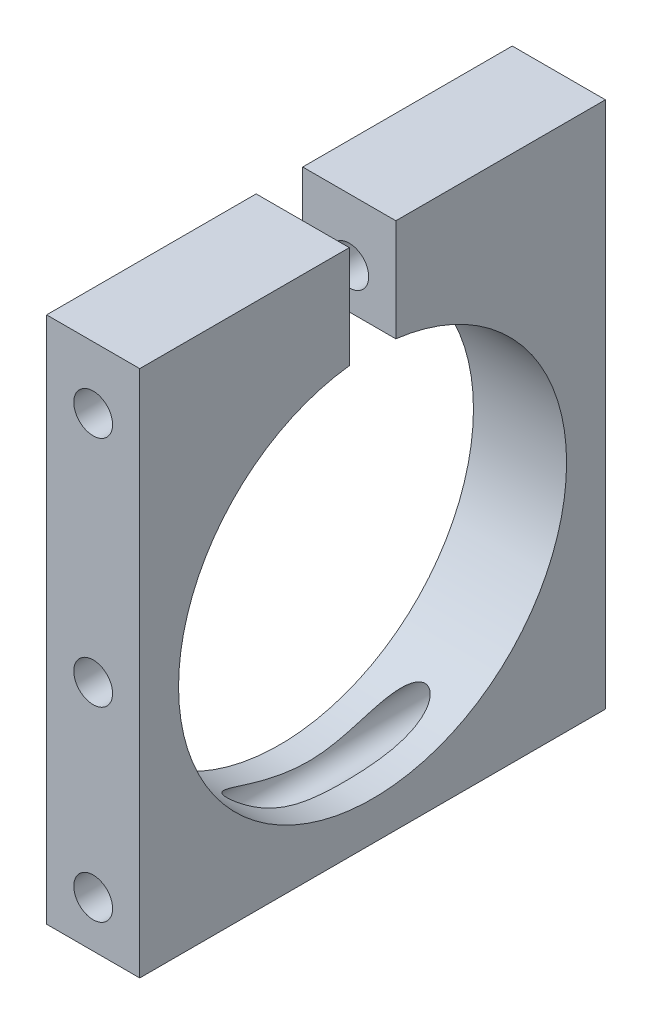
ISO-10303-21;
HEADER;
FILE_DESCRIPTION(('STEP AP214'),'2;1');
FILE_NAME('part.step','',(''),(''),'','','');
FILE_SCHEMA(('AUTOMOTIVE_DESIGN { 1 0 10303 214 1 1 1 1 }'));
ENDSEC;
DATA;
#1=APPLICATION_CONTEXT('core data for automotive mechanical design processes');
#2=APPLICATION_PROTOCOL_DEFINITION('international standard','automotive_design',2000,#1);
#3=PRODUCT_CONTEXT('',#1,'mechanical');
#4=PRODUCT('Part','Part','',(#3));
#5=PRODUCT_RELATED_PRODUCT_CATEGORY('part','',(#4));
#6=PRODUCT_DEFINITION_FORMATION('','',#4);
#7=PRODUCT_DEFINITION_CONTEXT('part definition',#1,'design');
#8=PRODUCT_DEFINITION('design','',#6,#7);
#9=PRODUCT_DEFINITION_SHAPE('','',#8);
#10=(LENGTH_UNIT() NAMED_UNIT(*) SI_UNIT(.MILLI.,.METRE.));
#11=(NAMED_UNIT(*) PLANE_ANGLE_UNIT() SI_UNIT($,.RADIAN.));
#12=(NAMED_UNIT(*) SI_UNIT($,.STERADIAN.) SOLID_ANGLE_UNIT());
#13=UNCERTAINTY_MEASURE_WITH_UNIT(LENGTH_MEASURE(1.E-05),#10,'distance_accuracy_value','');
#14=(GEOMETRIC_REPRESENTATION_CONTEXT(3) GLOBAL_UNCERTAINTY_ASSIGNED_CONTEXT((#13)) GLOBAL_UNIT_ASSIGNED_CONTEXT((#10,
#11,#12)) REPRESENTATION_CONTEXT('',''));
#15=CARTESIAN_POINT('',(0.,0.,0.));
#16=DIRECTION('',(0.,0.,1.));
#17=DIRECTION('',(1.,0.,0.));
#18=AXIS2_PLACEMENT_3D('',#15,#16,#17);
#19=CARTESIAN_POINT('',(81.9999999999995,682.332012286218,-386.357743681072));
#20=DIRECTION('',(0.,0.,-1.));
#21=DIRECTION('',(-1.,0.,0.));
#22=AXIS2_PLACEMENT_3D('',#19,#20,#21);
#23=CYLINDRICAL_SURFACE('',#22,1.25);
#24=CARTESIAN_POINT('',(81.9999999999995,682.332012286218,-387.857743681072));
#25=DIRECTION('',(0.,0.,-1.));
#26=DIRECTION('',(-1.,0.,0.));
#27=AXIS2_PLACEMENT_3D('',#24,#25,#26);
#28=CIRCLE('',#27,1.25);
#29=CARTESIAN_POINT('',(80.7499999999995,682.332012286218,-387.857743681072));
#30=VERTEX_POINT('',#29);
#31=EDGE_CURVE('E153',#30,#30,#28,.T.);
#32=ORIENTED_EDGE('',*,*,#31,.F.);
#33=EDGE_LOOP('',(#32));
#34=FACE_BOUND('',#33,.T.);
#35=CARTESIAN_POINT('',(81.9999999999995,682.332012286218,-401.357743681072));
#36=DIRECTION('',(0.,0.,-1.));
#37=DIRECTION('',(-1.,0.,0.));
#38=AXIS2_PLACEMENT_3D('',#35,#36,#37);
#39=CIRCLE('',#38,1.25);
#40=CARTESIAN_POINT('',(80.7499999999995,682.332012286218,-401.357743681072));
#41=VERTEX_POINT('',#40);
#42=EDGE_CURVE('E157',#41,#41,#39,.T.);
#43=ORIENTED_EDGE('',*,*,#42,.T.);
#44=EDGE_LOOP('',(#43));
#45=FACE_BOUND('',#44,.T.);
#46=ADVANCED_FACE('F17',(#34,#45),#23,.F.);
#47=CARTESIAN_POINT('',(81.9999999999995,667.332012286217,-376.357743681072));
#48=DIRECTION('',(0.,0.,-1.));
#49=DIRECTION('',(0.,1.,0.));
#50=AXIS2_PLACEMENT_3D('',#47,#48,#49);
#51=CYLINDRICAL_SURFACE('',#50,1.25);
#52=CARTESIAN_POINT('',(83.2499999999995,667.332012286217,-373.857743681072));
#53=CARTESIAN_POINT('',(83.2499969955918,667.261985674511,-373.857744480073));
#54=CARTESIAN_POINT('',(83.2440958077508,667.191913630953,-373.858338370804));
#55=CARTESIAN_POINT('',(83.2206441948354,667.053713120907,-373.860650370675));
#56=CARTESIAN_POINT('',(83.2030811574912,666.985586842051,-373.862369696943));
#57=CARTESIAN_POINT('',(83.1568222460876,666.853297784837,-373.866738494325));
#58=CARTESIAN_POINT('',(83.1281330110469,666.789132669263,-373.869387410662));
#59=CARTESIAN_POINT('',(83.060449015238,666.666542320464,-373.875319201094));
#60=CARTESIAN_POINT('',(83.021456264004,666.608115971028,-373.878601951537));
#61=CARTESIAN_POINT('',(82.9341216261066,666.498437842798,-373.885446876922));
#62=CARTESIAN_POINT('',(82.8857502466206,666.447209600073,-373.889009911695));
#63=CARTESIAN_POINT('',(82.7810943273916,666.353584131562,-373.896006720044));
#64=CARTESIAN_POINT('',(82.7248094224967,666.311187313507,-373.899440487646));
#65=CARTESIAN_POINT('',(82.6057767952533,666.23634479774,-373.905798788802));
#66=CARTESIAN_POINT('',(82.5430156101689,666.203920410602,-373.908722226122));
#67=CARTESIAN_POINT('',(82.4129054266863,666.150079276401,-373.913718214551));
#68=CARTESIAN_POINT('',(82.3455565478612,666.128662242568,-373.915790787825));
#69=CARTESIAN_POINT('',(82.2084228017919,666.097513496094,-373.918842628985));
#70=CARTESIAN_POINT('',(82.1386468868123,666.08774273459,-373.919825549594));
#71=CARTESIAN_POINT('',(81.9984390293851,666.080043177061,-373.920598143115));
#72=CARTESIAN_POINT('',(81.9280071032143,666.082114088,-373.920387845554));
#73=CARTESIAN_POINT('',(81.7887561658135,666.098006899871,-373.918801098304));
#74=CARTESIAN_POINT('',(81.7199322266656,666.111786105553,-373.917428885696));
#75=CARTESIAN_POINT('',(81.5855781194365,666.150638141965,-373.913679523273));
#76=CARTESIAN_POINT('',(81.5200480245707,666.175711223612,-373.911302351131));
#77=CARTESIAN_POINT('',(81.3940054119532,666.236487405701,-373.905805949153));
#78=CARTESIAN_POINT('',(81.3335022650871,666.2722098135,-373.902685373601));
#79=CARTESIAN_POINT('',(81.2193390300373,666.353253579349,-373.896055244123));
#80=CARTESIAN_POINT('',(81.1656785779334,666.398574426578,-373.892545710901));
#81=CARTESIAN_POINT('',(81.0664797574863,666.497757882333,-373.885514677716));
#82=CARTESIAN_POINT('',(81.0209766010341,666.551655712007,-373.881993189712));
#83=CARTESIAN_POINT('',(80.9396370083352,666.666373303914,-373.875347269173));
#84=CARTESIAN_POINT('',(80.9038050527791,666.72719625608,-373.872223021033));
#85=CARTESIAN_POINT('',(80.8428305879488,666.854077617356,-373.866722328111));
#86=CARTESIAN_POINT('',(80.8176987553329,666.920141177991,-373.864346630849));
#87=CARTESIAN_POINT('',(80.7789466387922,667.055489106096,-373.860620260684));
#88=CARTESIAN_POINT('',(80.7653019330635,667.124766308539,-373.859267413812));
#89=CARTESIAN_POINT('',(80.7550507429326,667.217423212892,-373.858247851176));
#90=CARTESIAN_POINT('',(80.7531581063268,667.240296935282,-373.858059162288));
#91=CARTESIAN_POINT('',(80.750632239924,667.286114539903,-373.857806950016));
#92=CARTESIAN_POINT('',(80.7499990111671,667.30905842219,-373.857743426736));
#93=CARTESIAN_POINT('',(80.7500030139628,667.401975711905,-373.85774445629));
#94=CARTESIAN_POINT('',(80.7558981102406,667.472031871111,-373.858337745769));
#95=CARTESIAN_POINT('',(80.77933787917,667.610249115089,-373.860648628231));
#96=CARTESIAN_POINT('',(80.7969070446603,667.678405900947,-373.862368584916));
#97=CARTESIAN_POINT('',(80.843180932849,667.810733970928,-373.866738792365));
#98=CARTESIAN_POINT('',(80.8718748618873,667.874909048454,-373.869388141163));
#99=CARTESIAN_POINT('',(80.9395617505016,667.997498864672,-373.875320104249));
#100=CARTESIAN_POINT('',(80.9785498714353,668.055916291999,-373.878602420823));
#101=CARTESIAN_POINT('',(81.0658723326486,668.165579157385,-373.885446415056));
#102=CARTESIAN_POINT('',(81.1142361802256,668.216801048017,-373.889008953019));
#103=CARTESIAN_POINT('',(81.21889097028,668.310429069645,-373.896005788212));
#104=CARTESIAN_POINT('',(81.2751844083647,668.352832414816,-373.899440044637));
#105=CARTESIAN_POINT('',(81.3942539738693,668.42770008865,-373.905800546142));
#106=CARTESIAN_POINT('',(81.4570461783689,668.460138940866,-373.908725480903));
#107=CARTESIAN_POINT('',(81.5871757085338,668.513969659556,-373.913720447834));
#108=CARTESIAN_POINT('',(81.6545078647821,668.53537385823,-373.915791433848));
#109=CARTESIAN_POINT('',(81.7685071332165,668.561272962073,-373.918329737314));
#110=CARTESIAN_POINT('',(81.8144508698856,668.56903945356,-373.919102625982));
#111=CARTESIAN_POINT('',(81.9069230472283,668.579410103843,-373.920138385462));
#112=CARTESIAN_POINT('',(81.9534514855269,668.582014283602,-373.920401258346));
#113=CARTESIAN_POINT('',(82.070025574823,668.582009281437,-373.920399903221));
#114=CARTESIAN_POINT('',(82.1400965838235,668.576108264745,-373.919802959789));
#115=CARTESIAN_POINT('',(82.2782950520943,668.552657360141,-373.917480054416));
#116=CARTESIAN_POINT('',(82.3464203200711,668.535094839859,-373.915752868164));
#117=CARTESIAN_POINT('',(82.4787082967664,668.488837097172,-373.911366985561));
#118=CARTESIAN_POINT('',(82.5428732883818,668.460148359266,-373.908708831876));
#119=CARTESIAN_POINT('',(82.6654614899794,668.392466413102,-373.902761325386));
#120=CARTESIAN_POINT('',(82.7238860079125,668.353475559656,-373.899472116871));
#121=CARTESIAN_POINT('',(82.8335580075294,668.266148201436,-373.892619974992));
#122=CARTESIAN_POINT('',(82.8847823924164,668.217782754015,-373.889056215069));
#123=CARTESIAN_POINT('',(82.9784126815764,668.11312637239,-373.882063127796));
#124=CARTESIAN_POINT('',(83.0208162358817,668.056833332867,-373.878633836465));
#125=CARTESIAN_POINT('',(83.0956842718507,667.937764665402,-373.872287149156));
#126=CARTESIAN_POINT('',(83.1281233183662,667.874972985928,-373.869371071153));
#127=CARTESIAN_POINT('',(83.1819547626129,667.74484407311,-373.864393757066));
#128=CARTESIAN_POINT('',(83.2033594023271,667.677511971308,-373.86233157414));
#129=CARTESIAN_POINT('',(83.2292595334468,667.563511506854,-373.859804653898));
#130=CARTESIAN_POINT('',(83.2370264626378,667.517566451117,-373.859035447254));
#131=CARTESIAN_POINT('',(83.2473976799514,667.425091715335,-373.858004696706));
#132=CARTESIAN_POINT('',(83.2500019971608,667.378562038586,-373.857743149941));
#133=CARTESIAN_POINT('',(83.2499999999995,667.332012286217,-373.857743681072));
#134=B_SPLINE_CURVE_WITH_KNOTS('',3,(#52,#53,#54,#55,#56,#57,#58,#59,#60,#61,#62,#63,#64,#65,
#66,#67,#68,#69,#70,#71,#72,#73,#74,#75,#76,#77,#78,#79,#80,#81,#82,#83,#84,#85,#86,#87,#88,#89,
#90,#91,#92,#93,#94,#95,#96,#97,#98,#99,#100,#101,#102,#103,#104,#105,#106,#107,#108,#109,#110,
#111,#112,#113,#114,#115,#116,#117,#118,#119,#120,#121,#122,#123,#124,#125,#126,#127,#128,#129,
#130,#131,#132,#133),.UNSPECIFIED.,.T.,.F.,(4,2,2,2,2,2,2,2,2,2,2,2,2,2,2,2,2,2,2,2,2,2,2,2,2,2,
2,2,2,2,2,2,2,2,2,2,2,2,2,2,4),(0.,0.209909957865161,0.420047303545414,0.630059452406449,
0.84003067198432,1.05067321971514,1.26132549026481,1.47242483538548,1.6835186805389,
1.89390273872008,2.10428159070432,2.31389655524151,2.52351617703734,2.73351817724369,
2.94350900409216,3.15438552915413,3.36535958675799,3.57654366519953,3.78727762108979,
3.85611047774897,3.92494339125334,4.13474625595609,4.34499069435888,4.55503165420716,
4.76497406242565,4.97558825481878,5.18626888059749,5.39748375910335,5.60846207177879,
5.74799525534997,5.8875278723159,6.09743471510885,6.30756931209431,6.51758162356336,
6.72754597280562,6.93816918873561,7.14884844538226,7.36006109140407,7.57103890318506,
7.71057602162499,7.85011235389017),.UNSPECIFIED.);
#135=CARTESIAN_POINT('',(83.2499999999995,667.332012286217,-373.857743681072));
#136=VERTEX_POINT('',#135);
#137=EDGE_CURVE('E102',#136,#136,#134,.T.);
#138=ORIENTED_EDGE('',*,*,#137,.T.);
#139=EDGE_LOOP('',(#138));
#140=FACE_BOUND('',#139,.T.);
#141=CARTESIAN_POINT('',(81.9999999999995,667.332012286217,-371.357743681072));
#142=DIRECTION('',(0.,0.,-1.));
#143=DIRECTION('',(0.,1.,0.));
#144=AXIS2_PLACEMENT_3D('',#141,#142,#143);
#145=CIRCLE('',#144,1.25);
#146=CARTESIAN_POINT('',(81.9999999999995,668.582012286217,-371.357743681072));
#147=VERTEX_POINT('',#146);
#148=EDGE_CURVE('E139',#147,#147,#145,.F.);
#149=ORIENTED_EDGE('',*,*,#148,.T.);
#150=EDGE_LOOP('',(#149));
#151=FACE_BOUND('',#150,.T.);
#152=ADVANCED_FACE('F278',(#140,#151),#51,.F.);
#153=CARTESIAN_POINT('',(81.9999999999995,682.332012286218,-386.357743681072));
#154=DIRECTION('',(0.,0.,-1.));
#155=DIRECTION('',(-1.,0.,0.));
#156=AXIS2_PLACEMENT_3D('',#153,#154,#155);
#157=CYLINDRICAL_SURFACE('',#156,1.25);
#158=CARTESIAN_POINT('',(81.9999999999995,682.332012286218,-384.857743681072));
#159=DIRECTION('',(0.,0.,-1.));
#160=DIRECTION('',(-1.,0.,0.));
#161=AXIS2_PLACEMENT_3D('',#158,#159,#160);
#162=CIRCLE('',#161,1.25);
#163=CARTESIAN_POINT('',(80.7499999999995,682.332012286218,-384.857743681072));
#164=VERTEX_POINT('',#163);
#165=EDGE_CURVE('E20',#164,#164,#162,.F.);
#166=ORIENTED_EDGE('',*,*,#165,.F.);
#167=EDGE_LOOP('',(#166));
#168=FACE_BOUND('',#167,.T.);
#169=CARTESIAN_POINT('',(81.9999999999995,682.332012286218,-371.357743681072));
#170=DIRECTION('',(0.,0.,-1.));
#171=DIRECTION('',(-1.,0.,0.));
#172=AXIS2_PLACEMENT_3D('',#169,#170,#171);
#173=CIRCLE('',#172,1.25);
#174=CARTESIAN_POINT('',(80.7499999999995,682.332012286218,-371.357743681072));
#175=VERTEX_POINT('',#174);
#176=EDGE_CURVE('E168',#175,#175,#173,.F.);
#177=ORIENTED_EDGE('',*,*,#176,.T.);
#178=EDGE_LOOP('',(#177));
#179=FACE_BOUND('',#178,.T.);
#180=ADVANCED_FACE('F207',(#168,#179),#157,.F.);
#181=CARTESIAN_POINT('',(81.9999999999991,655.332012286218,-386.357743681072));
#182=DIRECTION('',(0.,0.,-1.));
#183=DIRECTION('',(-1.,0.,0.));
#184=AXIS2_PLACEMENT_3D('',#181,#182,#183);
#185=CYLINDRICAL_SURFACE('',#184,1.25);
#186=CARTESIAN_POINT('',(81.9999999999991,656.582012286218,-392.736419092158));
#187=CARTESIAN_POINT('',(81.9620583239072,656.582010238259,-392.736415954482));
#188=CARTESIAN_POINT('',(81.924092424661,656.580267699896,-392.733481741806));
#189=CARTESIAN_POINT('',(81.8493161520983,656.573466964166,-392.721998875565));
#190=CARTESIAN_POINT('',(81.8125071857353,656.568404881837,-392.713443643527));
#191=CARTESIAN_POINT('',(81.7412030755132,656.55546226832,-392.691473109544));
#192=CARTESIAN_POINT('',(81.706694051138,656.547600895967,-392.678090836825));
#193=CARTESIAN_POINT('',(81.6401977453358,656.529606155248,-392.647285870885));
#194=CARTESIAN_POINT('',(81.6082111558142,656.519472166411,-392.629862074202));
#195=CARTESIAN_POINT('',(81.5265699685594,656.490157835122,-392.579119477516));
#196=CARTESIAN_POINT('',(81.4792623082635,656.469434438726,-392.542921400854));
#197=CARTESIAN_POINT('',(81.3916134568367,656.425078541258,-392.464366687458));
#198=CARTESIAN_POINT('',(81.3512946139946,656.40143710719,-392.421991063913));
#199=CARTESIAN_POINT('',(81.2820265090196,656.35596481696,-392.33923964225));
#200=CARTESIAN_POINT('',(81.2522758180749,656.334340957646,-392.299408491014));
#201=CARTESIAN_POINT('',(81.1967553203672,656.2904221462,-392.217390405549));
#202=CARTESIAN_POINT('',(81.1709885735707,656.268126693785,-392.175201694063));
#203=CARTESIAN_POINT('',(81.0988273355814,656.200772047024,-392.045880474076));
#204=CARTESIAN_POINT('',(81.057632127511,656.155287151921,-391.956069829445));
#205=CARTESIAN_POINT('',(80.9850112472775,656.063972516427,-391.769982309982));
#206=CARTESIAN_POINT('',(80.9538395520347,656.018160043598,-391.673602763513));
#207=CARTESIAN_POINT('',(80.9000621212427,655.92815231727,-391.477666883314));
#208=CARTESIAN_POINT('',(80.8774654730462,655.883958824019,-391.378107299983));
#209=CARTESIAN_POINT('',(80.8390077502221,655.797663635509,-391.176546350131));
#210=CARTESIAN_POINT('',(80.823163424346,655.755567367847,-391.074539567206));
#211=CARTESIAN_POINT('',(80.7968988380114,655.67389588095,-390.868903153366));
#212=CARTESIAN_POINT('',(80.7864763712189,655.634319641995,-390.765274200279));
#213=CARTESIAN_POINT('',(80.768425503736,655.550807029784,-390.537516039533));
#214=CARTESIAN_POINT('',(80.761663950458,655.507408094444,-390.413122917612));
#215=CARTESIAN_POINT('',(80.7527315866522,655.424516557999,-390.162862736094));
#216=CARTESIAN_POINT('',(80.7505619648898,655.385024970956,-390.036995303301));
#217=CARTESIAN_POINT('',(80.7496303175335,655.310005675583,-389.783935760658));
#218=CARTESIAN_POINT('',(80.7508718741081,655.274482175002,-389.656742398105));
#219=CARTESIAN_POINT('',(80.7557654346603,655.207491609528,-389.401332739718));
#220=CARTESIAN_POINT('',(80.7594177180169,655.176025015297,-389.273116327024));
#221=CARTESIAN_POINT('',(80.7726450051771,655.087765046217,-388.887180746347));
#222=CARTESIAN_POINT('',(80.7844910557991,655.037094878206,-388.628119188462));
#223=CARTESIAN_POINT('',(80.8082599654921,654.952279894978,-388.107524553008));
#224=CARTESIAN_POINT('',(80.8201827607839,654.918122799614,-387.845993459966));
#225=CARTESIAN_POINT('',(80.8374525033302,654.872191214915,-387.379873878632));
#226=CARTESIAN_POINT('',(80.8436739554429,654.85711830315,-387.175640818062));
#227=CARTESIAN_POINT('',(80.8521232965704,654.83703530649,-386.766852730234));
#228=CARTESIAN_POINT('',(80.8543563234984,654.832012274276,-386.562298457446));
#229=CARTESIAN_POINT('',(80.854355823106,654.832012298446,-386.148294362564));
#230=CARTESIAN_POINT('',(80.852014142554,654.83727861133,-385.938844516084));
#231=CARTESIAN_POINT('',(80.8431743715516,654.858322493095,-385.52052600228));
#232=CARTESIAN_POINT('',(80.8366754334,654.874102205779,-385.311657462217));
#233=CARTESIAN_POINT('',(80.8209743398157,654.916197352921,-384.894287188887));
#234=CARTESIAN_POINT('',(80.8117619379544,654.942552862345,-384.685789915798));
#235=CARTESIAN_POINT('',(80.7928860816381,655.005728115912,-384.270439728651));
#236=CARTESIAN_POINT('',(80.7832226947959,655.042546295648,-384.063586573509));
#237=CARTESIAN_POINT('',(80.7662055876483,655.126808376981,-383.650786127465));
#238=CARTESIAN_POINT('',(80.7588646577961,655.174308738361,-383.444849807547));
#239=CARTESIAN_POINT('',(80.7499658323201,655.279776564456,-383.035347622215));
#240=CARTESIAN_POINT('',(80.7484115587207,655.337750561112,-382.831783320938));
#241=CARTESIAN_POINT('',(80.7536254330404,655.432143929487,-382.529666772488));
#242=CARTESIAN_POINT('',(80.7565977947674,655.464721800743,-382.429839224293));
#243=CARTESIAN_POINT('',(80.7656835527425,655.532334719544,-382.231169680477));
#244=CARTESIAN_POINT('',(80.77179647648,655.567369396766,-382.132327538877));
#245=CARTESIAN_POINT('',(80.7879094782704,655.639761956372,-381.935954464242));
#246=CARTESIAN_POINT('',(80.7979045847039,655.67711681628,-381.838422018587));
#247=CARTESIAN_POINT('',(80.8227006672051,655.754032668351,-381.644865434439));
#248=CARTESIAN_POINT('',(80.8374998012721,655.793592810141,-381.548840732605));
#249=CARTESIAN_POINT('',(80.8639268693705,655.853835060058,-381.407594903611));
#250=CARTESIAN_POINT('',(80.8732760356789,655.873770850079,-381.361625675436));
#251=CARTESIAN_POINT('',(80.8935513123851,655.914059713967,-381.270224064769));
#252=CARTESIAN_POINT('',(80.9044774218229,655.93441278758,-381.22479168195));
#253=CARTESIAN_POINT('',(80.9399967991429,655.996217644722,-381.08900017262));
#254=CARTESIAN_POINT('',(80.9672578594065,656.038240032619,-380.999556589137));
#255=CARTESIAN_POINT('',(81.0199274824556,656.108655702697,-380.854071291457));
#256=CARTESIAN_POINT('',(81.0428168139872,656.136827151103,-380.797008844043));
#257=CARTESIAN_POINT('',(81.0932178730862,656.193220625881,-380.684891357616));
#258=CARTESIAN_POINT('',(81.1207330074112,656.221442674251,-380.62983783475));
#259=CARTESIAN_POINT('',(81.1810256070357,656.27724160796,-380.522877801885));
#260=CARTESIAN_POINT('',(81.213767603685,656.304821499466,-380.470953118648));
#261=CARTESIAN_POINT('',(81.2856056579191,656.358732867007,-380.371063361451));
#262=CARTESIAN_POINT('',(81.3246885446156,656.385066787695,-380.323090384193));
#263=CARTESIAN_POINT('',(81.3984039945546,656.428306800963,-380.245411655401));
#264=CARTESIAN_POINT('',(81.431242796146,656.445795474662,-380.21434026231));
#265=CARTESIAN_POINT('',(81.5012349049624,656.478847628426,-380.156136231997));
#266=CARTESIAN_POINT('',(81.5383914762803,656.494409633395,-380.129006609947));
#267=CARTESIAN_POINT('',(81.6176302241523,656.522846950722,-380.079785112982));
#268=CARTESIAN_POINT('',(81.6597682585349,656.535686175898,-380.057760582642));
#269=CARTESIAN_POINT('',(81.7480796863071,656.557197403672,-380.021039072499));
#270=CARTESIAN_POINT('',(81.7942388630142,656.565883435228,-380.006317418105));
#271=CARTESIAN_POINT('',(81.867526805367,656.575248478394,-379.990478000767));
#272=CARTESIAN_POINT('',(81.8937689600935,656.577772408833,-379.98621831707));
#273=CARTESIAN_POINT('',(81.9466703111573,656.581155042234,-379.980512329084));
#274=CARTESIAN_POINT('',(81.9733295245162,656.582013677049,-379.979066139927));
#275=CARTESIAN_POINT('',(82.0379431249868,656.582010307533,-379.979071300343));
#276=CARTESIAN_POINT('',(82.0759090442073,656.580267660314,-379.982005689429));
#277=CARTESIAN_POINT('',(82.15068483605,656.573466779997,-379.993488795393));
#278=CARTESIAN_POINT('',(82.1874933418833,656.568404770581,-380.002043906785));
#279=CARTESIAN_POINT('',(82.2587968038081,656.555462305607,-380.024014189993));
#280=CARTESIAN_POINT('',(82.2933056180857,656.547600976312,-380.037396388754));
#281=CARTESIAN_POINT('',(82.3598019172153,656.529606255756,-380.068201318227));
#282=CARTESIAN_POINT('',(82.3917886848011,656.519472221268,-380.085625192871));
#283=CARTESIAN_POINT('',(82.4734306665357,656.490157611026,-380.136368272725));
#284=CARTESIAN_POINT('',(82.5207388568984,656.46943392999,-380.172566850275));
#285=CARTESIAN_POINT('',(82.6083875318309,656.42507795949,-380.251121717075));
#286=CARTESIAN_POINT('',(82.6487058428495,656.40143680693,-380.29349684461));
#287=CARTESIAN_POINT('',(82.71797193583,656.355965838171,-380.376245861508));
#288=CARTESIAN_POINT('',(82.7477212931547,656.33434305683,-380.416075004242));
#289=CARTESIAN_POINT('',(82.8032394732142,656.290426450382,-380.498088865034));
#290=CARTESIAN_POINT('',(82.8290052377775,656.268132125269,-380.540275359321));
#291=CARTESIAN_POINT('',(82.9011686584741,656.200776481952,-380.669598135095));
#292=CARTESIAN_POINT('',(82.9423661228589,656.155289349602,-380.759413054181));
#293=CARTESIAN_POINT('',(83.0149955301182,656.063963996806,-380.945522413983));
#294=CARTESIAN_POINT('',(83.0461719614215,656.018143148506,-381.041920146693));
#295=CARTESIAN_POINT('',(83.0999559960588,655.928119619632,-381.237892890135));
#296=CARTESIAN_POINT('',(83.1225545468208,655.883918692809,-381.337471137941));
#297=CARTESIAN_POINT('',(83.1610070953829,655.797625522857,-381.539032702268));
#298=CARTESIAN_POINT('',(83.17684685799,655.75553789349,-381.641020622148));
#299=CARTESIAN_POINT('',(83.2031047850426,655.67388211859,-381.846620245664));
#300=CARTESIAN_POINT('',(83.213525070007,655.63431299295,-381.950231297832));
#301=CARTESIAN_POINT('',(83.2315680156594,655.550836990123,-382.17788961091));
#302=CARTESIAN_POINT('',(83.2383270761529,655.50746553556,-382.302199793624));
#303=CARTESIAN_POINT('',(83.2472596370174,655.424623749421,-382.552292242471));
#304=CARTESIAN_POINT('',(83.2494319563678,655.38515442508,-382.678074879359));
#305=CARTESIAN_POINT('',(83.2503720111253,655.310177100823,-382.930953895138));
#306=CARTESIAN_POINT('',(83.2491364237405,655.274673002208,-383.05805143575));
#307=CARTESIAN_POINT('',(83.244256492208,655.207715213441,-383.313268281298));
#308=CARTESIAN_POINT('',(83.2406118724239,655.176261987273,-383.441387701497));
#309=CARTESIAN_POINT('',(83.2273956349898,655.087956987044,-383.827362126639));
#310=CARTESIAN_POINT('',(83.2155445757064,655.037240426804,-384.086561571913));
#311=CARTESIAN_POINT('',(83.1917613979586,654.952337746909,-384.607521193494));
#312=CARTESIAN_POINT('',(83.1798293182648,654.918144217869,-384.869280168212));
#313=CARTESIAN_POINT('',(83.1643318600961,654.876943347316,-385.287386094101));
#314=CARTESIAN_POINT('',(83.1593392090146,654.864536074686,-385.443161407014));
#315=CARTESIAN_POINT('',(83.1515127504663,654.845568573052,-385.755131046194));
#316=CARTESIAN_POINT('',(83.1486789765784,654.839008434993,-385.911325378939));
#317=CARTESIAN_POINT('',(83.1455364237539,654.83175096809,-386.223906715575));
#318=CARTESIAN_POINT('',(83.1452281489192,654.831054809724,-386.380293751701));
#319=CARTESIAN_POINT('',(83.1471753378965,654.835529912223,-386.692965774245));
#320=CARTESIAN_POINT('',(83.1494307733947,654.840701108289,-386.849250761773));
#321=CARTESIAN_POINT('',(83.1562136435703,654.856884730869,-387.161202639927));
#322=CARTESIAN_POINT('',(83.1607372522147,654.867887322558,-387.316870127969));
#323=CARTESIAN_POINT('',(83.1714768578483,654.895705495017,-387.627630114725));
#324=CARTESIAN_POINT('',(83.1776929233192,654.912521311014,-387.782722589914));
#325=CARTESIAN_POINT('',(83.1909960871109,654.951933144276,-388.092087801963));
#326=CARTESIAN_POINT('',(83.1980829437997,654.974527559936,-388.246360753888));
#327=CARTESIAN_POINT('',(83.2121177456241,655.02546942505,-388.553945229168));
#328=CARTESIAN_POINT('',(83.2190657056347,655.053816254787,-388.707256854256));
#329=CARTESIAN_POINT('',(83.229862277873,655.107382664222,-388.969429208504));
#330=CARTESIAN_POINT('',(83.2340309847143,655.131208253498,-389.078562324953));
#331=CARTESIAN_POINT('',(83.2412009555881,655.181779508066,-389.296165819671));
#332=CARTESIAN_POINT('',(83.2442023906958,655.20852474472,-389.404636292762));
#333=CARTESIAN_POINT('',(83.2506904577832,655.293213178367,-389.729294759829));
#334=CARTESIAN_POINT('',(83.251646287888,655.355550157454,-389.944441170724));
#335=CARTESIAN_POINT('',(83.2436808982311,655.463826112288,-390.283773312811));
#336=CARTESIAN_POINT('',(83.2386324305021,655.506070926952,-390.40923800798));
#337=CARTESIAN_POINT('',(83.2229749056382,655.594404466566,-390.658443682759));
#338=CARTESIAN_POINT('',(83.2123675532997,655.640492009387,-390.782185178901));
#339=CARTESIAN_POINT('',(83.1839250793555,655.736120546514,-391.027060577141));
#340=CARTESIAN_POINT('',(83.166112664557,655.785650290276,-391.148201423692));
#341=CARTESIAN_POINT('',(83.1210398323842,655.887796609134,-391.387333716643));
#342=CARTESIAN_POINT('',(83.0937895849412,655.94040981109,-391.505328406446));
#343=CARTESIAN_POINT('',(83.0386060628278,656.028759801437,-391.695652926489));
#344=CARTESIAN_POINT('',(83.0143436207799,656.063863121243,-391.769334634444));
#345=CARTESIAN_POINT('',(82.9593741840264,656.13457927034,-391.914179772449));
#346=CARTESIAN_POINT('',(82.9286596006216,656.170192653171,-391.985340120787));
#347=CARTESIAN_POINT('',(82.8590752373696,656.241402906818,-392.124417879131));
#348=CARTESIAN_POINT('',(82.8201477098505,656.276997769582,-392.192307906016));
#349=CARTESIAN_POINT('',(82.7323424851211,656.34656097878,-392.322241559134));
#350=CARTESIAN_POINT('',(82.683491221186,656.380533356048,-392.384300089148));
#351=CARTESIAN_POINT('',(82.5975899549996,656.430492754658,-392.473973059982));
#352=CARTESIAN_POINT('',(82.5647036676901,656.447854815704,-392.504793571012));
#353=CARTESIAN_POINT('',(82.4946396747066,656.480632538721,-392.562471875908));
#354=CARTESIAN_POINT('',(82.4574596167261,656.496047124008,-392.589327479102));
#355=CARTESIAN_POINT('',(82.378205434692,656.524174424356,-392.637985922235));
#356=CARTESIAN_POINT('',(82.3360752974507,656.536850452701,-392.659720470505));
#357=CARTESIAN_POINT('',(82.2478395623667,656.55802655704,-392.695856818427));
#358=CARTESIAN_POINT('',(82.201748246176,656.566540951338,-392.710283766546));
#359=CARTESIAN_POINT('',(82.1291808848251,656.575581849032,-392.725572200946));
#360=CARTESIAN_POINT('',(82.1035796276288,656.577981771722,-392.729622326244));
#361=CARTESIAN_POINT('',(82.0519893946064,656.581197761678,-392.735046964606));
#362=CARTESIAN_POINT('',(82.026000384879,656.582013689628,-392.736421242322));
#363=CARTESIAN_POINT('',(81.9999999999991,656.582012286218,-392.736419092158));
#364=B_SPLINE_CURVE_WITH_KNOTS('',3,(#186,#187,#188,#189,#190,#191,#192,#193,#194,#195,#196,
#197,#198,#199,#200,#201,#202,#203,#204,#205,#206,#207,#208,#209,#210,#211,#212,#213,#214,#215,
#216,#217,#218,#219,#220,#221,#222,#223,#224,#225,#226,#227,#228,#229,#230,#231,#232,#233,#234,
#235,#236,#237,#238,#239,#240,#241,#242,#243,#244,#245,#246,#247,#248,#249,#250,#251,#252,#253,
#254,#255,#256,#257,#258,#259,#260,#261,#262,#263,#264,#265,#266,#267,#268,#269,#270,#271,#272,
#273,#274,#275,#276,#277,#278,#279,#280,#281,#282,#283,#284,#285,#286,#287,#288,#289,#290,#291,
#292,#293,#294,#295,#296,#297,#298,#299,#300,#301,#302,#303,#304,#305,#306,#307,#308,#309,#310,
#311,#312,#313,#314,#315,#316,#317,#318,#319,#320,#321,#322,#323,#324,#325,#326,#327,#328,#329,
#330,#331,#332,#333,#334,#335,#336,#337,#338,#339,#340,#341,#342,#343,#344,#345,#346,#347,#348,
#349,#350,#351,#352,#353,#354,#355,#356,#357,#358,#359,#360,#361,#362,#363),.UNSPECIFIED.,.T.,
.F.,(4,2,2,2,2,2,2,2,2,2,2,2,2,2,2,2,2,2,2,2,2,2,2,2,2,2,2,2,2,2,2,2,2,2,2,2,2,2,2,2,2,2,2,2,2,
2,2,2,2,2,2,2,2,2,2,2,2,2,2,2,2,2,2,2,2,2,2,2,2,2,2,2,2,2,2,2,2,2,2,2,2,2,2,2,2,2,2,2,4),(0.,
0.113721890322072,0.227577110903427,0.340667608492681,0.453789019754761,0.641912274934715,
0.830626422084055,0.993034505980403,1.15556671828844,1.48094764319052,1.81402066107331,
2.14744567179975,2.48169297742575,2.81580416014927,3.2113855618147,3.60706935960477,
4.00316883416898,4.39931422075955,5.19142999368,5.98295579047189,6.59733783395487,
7.21092785445183,7.83919972331005,8.46759974317085,9.09840379712628,9.72911358112134,
10.3632387257243,10.997760719724,11.3128502480874,11.6278923838024,11.9425323919414,
12.2570519003815,12.4099373098442,12.5628226262346,12.8699456203733,13.0726891086877,
13.2755825705653,13.4771535795318,13.6783111360104,13.8234251775957,13.9686496432015,
14.1156928119738,14.2622357159922,14.3421696291199,14.4221068131779,14.5358305661655,
14.6496839235348,14.7627738543592,14.8758958326359,15.0640213961683,15.2527332326051,
15.4151334377527,15.5776577036943,15.903054433384,16.2361888414618,16.5696738482152,
16.9038578068543,17.2379109083142,17.633230548689,18.0286519658368,18.4244590647187,
18.8203114588486,19.6128646814016,20.4050621705399,20.8739969727796,21.3429390686486,
21.8119747653572,22.2810052820383,22.7492472701274,23.2175082074617,23.6856395013129,
24.1537203894598,24.489018395203,24.8242672411839,25.4956485398561,25.892956669795,
26.2901430246817,26.6860872769556,27.0816061920162,27.3368315385919,27.5923587667421,
27.849746420935,28.1064572705254,28.2510537321607,28.3957297889431,28.5422379338885,
28.6882383986839,28.7661620224362,28.844092499479),.UNSPECIFIED.);
#365=CARTESIAN_POINT('',(81.9999999999991,656.582012286218,-392.736419092158));
#366=VERTEX_POINT('',#365);
#367=EDGE_CURVE('E105',#366,#366,#364,.T.);
#368=ORIENTED_EDGE('',*,*,#367,.T.);
#369=EDGE_LOOP('',(#368));
#370=FACE_BOUND('',#369,.T.);
#371=CARTESIAN_POINT('',(81.9999999999991,655.332012286218,-401.357743681072));
#372=DIRECTION('',(0.,0.,-1.));
#373=DIRECTION('',(-1.,0.,0.));
#374=AXIS2_PLACEMENT_3D('',#371,#372,#373);
#375=CIRCLE('',#374,1.25);
#376=CARTESIAN_POINT('',(80.7499999999991,655.332012286218,-401.357743681072));
#377=VERTEX_POINT('',#376);
#378=EDGE_CURVE('E135',#377,#377,#375,.T.);
#379=ORIENTED_EDGE('',*,*,#378,.T.);
#380=EDGE_LOOP('',(#379));
#381=FACE_BOUND('',#380,.T.);
#382=CARTESIAN_POINT('',(81.9999999999991,655.332012286218,-371.357743681072));
#383=DIRECTION('',(0.,0.,-1.));
#384=DIRECTION('',(-1.,0.,0.));
#385=AXIS2_PLACEMENT_3D('',#382,#383,#384);
#386=CIRCLE('',#385,1.25);
#387=CARTESIAN_POINT('',(80.7499999999991,655.332012286218,-371.357743681072));
#388=VERTEX_POINT('',#387);
#389=EDGE_CURVE('E121',#388,#388,#386,.F.);
#390=ORIENTED_EDGE('',*,*,#389,.T.);
#391=EDGE_LOOP('',(#390));
#392=FACE_BOUND('',#391,.T.);
#393=ADVANCED_FACE('F188',(#370,#381,#392),#185,.F.);
#394=CARTESIAN_POINT('',(84.9999999999995,686.332012286218,-371.357743681072));
#395=DIRECTION('',(-1.,0.,0.));
#396=DIRECTION('',(0.,0.,1.));
#397=AXIS2_PLACEMENT_3D('',#394,#395,#396);
#398=PLANE('',#397);
#399=DIRECTION('',(0.,0.,-1.));
#400=VECTOR('',#399,1.);
#401=CARTESIAN_POINT('',(84.9999999999995,686.332012286218,-384.857743681072));
#402=LINE('',#401,#400);
#403=CARTESIAN_POINT('',(84.9999999999995,686.332012286218,-384.857743681072));
#404=VERTEX_POINT('',#403);
#405=CARTESIAN_POINT('',(84.9999999999995,686.332012286218,-371.357743681072));
#406=VERTEX_POINT('',#405);
#407=EDGE_CURVE('E119',#404,#406,#402,.F.);
#408=ORIENTED_EDGE('',*,*,#407,.T.);
#409=DIRECTION('',(0.,1.,0.));
#410=VECTOR('',#409,1.);
#411=CARTESIAN_POINT('',(84.9999999999995,686.332012286218,-371.357743681072));
#412=LINE('',#411,#410);
#413=CARTESIAN_POINT('',(84.9999999999995,652.332012286218,-371.357743681072));
#414=VERTEX_POINT('',#413);
#415=EDGE_CURVE('E124',#406,#414,#412,.F.);
#416=ORIENTED_EDGE('',*,*,#415,.T.);
#417=DIRECTION('',(0.,0.,1.));
#418=VECTOR('',#417,1.);
#419=CARTESIAN_POINT('',(84.9999999999995,652.332012286218,-401.357743681072));
#420=LINE('',#419,#418);
#421=CARTESIAN_POINT('',(84.9999999999995,652.332012286218,-401.357743681072));
#422=VERTEX_POINT('',#421);
#423=EDGE_CURVE('E133',#414,#422,#420,.F.);
#424=ORIENTED_EDGE('',*,*,#423,.T.);
#425=DIRECTION('',(0.,1.,0.));
#426=VECTOR('',#425,1.);
#427=CARTESIAN_POINT('',(84.9999999999995,686.332012286218,-401.357743681072));
#428=LINE('',#427,#426);
#429=CARTESIAN_POINT('',(84.9999999999995,686.332012286218,-401.357743681072));
#430=VERTEX_POINT('',#429);
#431=EDGE_CURVE('E142',#422,#430,#428,.T.);
#432=ORIENTED_EDGE('',*,*,#431,.T.);
#433=DIRECTION('',(0.,0.,-1.));
#434=VECTOR('',#433,1.);
#435=CARTESIAN_POINT('',(84.9999999999995,686.332012286218,-401.357743681072));
#436=LINE('',#435,#434);
#437=CARTESIAN_POINT('',(84.9999999999995,686.332012286218,-387.857743681072));
#438=VERTEX_POINT('',#437);
#439=EDGE_CURVE('E151',#430,#438,#436,.F.);
#440=ORIENTED_EDGE('',*,*,#439,.T.);
#441=DIRECTION('',(0.,1.,0.));
#442=VECTOR('',#441,1.);
#443=CARTESIAN_POINT('',(84.9999999999995,683.832012286218,-387.857743681072));
#444=LINE('',#443,#442);
#445=CARTESIAN_POINT('',(84.9999999999995,679.741685932209,-387.857743681072));
#446=VERTEX_POINT('',#445);
#447=EDGE_CURVE('E88',#446,#438,#444,.T.);
#448=ORIENTED_EDGE('',*,*,#447,.F.);
#449=CARTESIAN_POINT('',(84.9999999999995,667.332012286218,-386.357743681072));
#450=DIRECTION('',(1.,0.,0.));
#451=DIRECTION('',(0.,0.,-1.));
#452=AXIS2_PLACEMENT_3D('',#449,#450,#451);
#453=CIRCLE('',#452,12.5);
#454=CARTESIAN_POINT('',(84.9999999999995,679.741685932209,-384.857743681072));
#455=VERTEX_POINT('',#454);
#456=EDGE_CURVE('E80',#446,#455,#453,.F.);
#457=ORIENTED_EDGE('',*,*,#456,.T.);
#458=DIRECTION('',(0.,1.,0.));
#459=VECTOR('',#458,1.);
#460=CARTESIAN_POINT('',(84.9999999999995,683.832012286218,-384.857743681072));
#461=LINE('',#460,#459);
#462=EDGE_CURVE('E85',#404,#455,#461,.F.);
#463=ORIENTED_EDGE('',*,*,#462,.F.);
#464=EDGE_LOOP('',(#408,#416,#424,#432,#440,#448,#457,#463));
#465=FACE_BOUND('',#464,.T.);
#466=ADVANCED_FACE('F84',(#465),#398,.F.);
#467=CARTESIAN_POINT('',(81.9999999999995,683.832012286218,-384.857743681072));
#468=DIRECTION('',(0.,0.,-1.));
#469=DIRECTION('',(-1.,0.,0.));
#470=AXIS2_PLACEMENT_3D('',#467,#468,#469);
#471=PLANE('',#470);
#472=ORIENTED_EDGE('',*,*,#165,.T.);
#473=EDGE_LOOP('',(#472));
#474=FACE_BOUND('',#473,.T.);
#475=DIRECTION('',(1.,0.,0.));
#476=VECTOR('',#475,1.);
#477=CARTESIAN_POINT('',(81.9999999999995,679.741685932209,-384.857743681072));
#478=LINE('',#477,#476);
#479=CARTESIAN_POINT('',(78.9999999999995,679.741685932209,-384.857743681072));
#480=VERTEX_POINT('',#479);
#481=EDGE_CURVE('E90',#455,#480,#478,.F.);
#482=ORIENTED_EDGE('',*,*,#481,.T.);
#483=DIRECTION('',(0.,1.,0.));
#484=VECTOR('',#483,1.);
#485=CARTESIAN_POINT('',(78.9999999999995,686.332012286218,-384.857743681072));
#486=LINE('',#485,#484);
#487=CARTESIAN_POINT('',(78.9999999999995,686.332012286218,-384.857743681072));
#488=VERTEX_POINT('',#487);
#489=EDGE_CURVE('E112',#488,#480,#486,.F.);
#490=ORIENTED_EDGE('',*,*,#489,.F.);
#491=DIRECTION('',(1.,0.,0.));
#492=VECTOR('',#491,1.);
#493=CARTESIAN_POINT('',(78.9999999999995,686.332012286218,-384.857743681072));
#494=LINE('',#493,#492);
#495=EDGE_CURVE('E95',#488,#404,#494,.T.);
#496=ORIENTED_EDGE('',*,*,#495,.T.);
#497=ORIENTED_EDGE('',*,*,#462,.T.);
#498=EDGE_LOOP('',(#482,#490,#496,#497));
#499=FACE_BOUND('',#498,.T.);
#500=ADVANCED_FACE('F92',(#474,#499),#471,.T.);
#501=CARTESIAN_POINT('',(81.9999999999995,667.332012286218,-386.357743681072));
#502=DIRECTION('',(1.,0.,0.));
#503=DIRECTION('',(0.,0.,-1.));
#504=AXIS2_PLACEMENT_3D('',#501,#502,#503);
#505=CYLINDRICAL_SURFACE('',#504,12.5);
#506=ORIENTED_EDGE('',*,*,#367,.F.);
#507=EDGE_LOOP('',(#506));
#508=FACE_BOUND('',#507,.T.);
#509=ORIENTED_EDGE('',*,*,#137,.F.);
#510=EDGE_LOOP('',(#509));
#511=FACE_BOUND('',#510,.T.);
#512=ORIENTED_EDGE('',*,*,#456,.F.);
#513=DIRECTION('',(1.,0.,0.));
#514=VECTOR('',#513,1.);
#515=CARTESIAN_POINT('',(81.9999999999995,679.741685932209,-387.857743681072));
#516=LINE('',#515,#514);
#517=CARTESIAN_POINT('',(78.9999999999995,679.741685932209,-387.857743681072));
#518=VERTEX_POINT('',#517);
#519=EDGE_CURVE('E161',#518,#446,#516,.T.);
#520=ORIENTED_EDGE('',*,*,#519,.F.);
#521=CARTESIAN_POINT('',(78.9999999999995,667.332012286218,-386.357743681072));
#522=DIRECTION('',(1.,0.,0.));
#523=DIRECTION('',(0.,0.,-1.));
#524=AXIS2_PLACEMENT_3D('',#521,#522,#523);
#525=CIRCLE('',#524,12.5);
#526=EDGE_CURVE('E100',#480,#518,#525,.T.);
#527=ORIENTED_EDGE('',*,*,#526,.F.);
#528=ORIENTED_EDGE('',*,*,#481,.F.);
#529=EDGE_LOOP('',(#512,#520,#527,#528));
#530=FACE_BOUND('',#529,.T.);
#531=ADVANCED_FACE('F98',(#508,#511,#530),#505,.F.);
#532=CARTESIAN_POINT('',(81.9999999999995,683.832012286218,-387.857743681072));
#533=DIRECTION('',(0.,0.,1.));
#534=DIRECTION('',(1.,0.,0.));
#535=AXIS2_PLACEMENT_3D('',#532,#533,#534);
#536=PLANE('',#535);
#537=ORIENTED_EDGE('',*,*,#31,.T.);
#538=EDGE_LOOP('',(#537));
#539=FACE_BOUND('',#538,.T.);
#540=ORIENTED_EDGE('',*,*,#519,.T.);
#541=ORIENTED_EDGE('',*,*,#447,.T.);
#542=DIRECTION('',(1.,0.,0.));
#543=VECTOR('',#542,1.);
#544=CARTESIAN_POINT('',(78.9999999999995,686.332012286218,-387.857743681072));
#545=LINE('',#544,#543);
#546=CARTESIAN_POINT('',(78.9999999999995,686.332012286218,-387.857743681072));
#547=VERTEX_POINT('',#546);
#548=EDGE_CURVE('E145',#438,#547,#545,.F.);
#549=ORIENTED_EDGE('',*,*,#548,.T.);
#550=DIRECTION('',(0.,1.,0.));
#551=VECTOR('',#550,1.);
#552=CARTESIAN_POINT('',(78.9999999999995,686.332012286218,-387.857743681072));
#553=LINE('',#552,#551);
#554=EDGE_CURVE('E165',#518,#547,#553,.T.);
#555=ORIENTED_EDGE('',*,*,#554,.F.);
#556=EDGE_LOOP('',(#540,#541,#549,#555));
#557=FACE_BOUND('',#556,.T.);
#558=ADVANCED_FACE('F196',(#539,#557),#536,.T.);
#559=CARTESIAN_POINT('',(78.9999999999995,686.332012286218,-401.357743681072));
#560=DIRECTION('',(0.,-1.,0.));
#561=DIRECTION('',(0.,0.,-1.));
#562=AXIS2_PLACEMENT_3D('',#559,#560,#561);
#563=PLANE('',#562);
#564=ORIENTED_EDGE('',*,*,#439,.F.);
#565=DIRECTION('',(1.,0.,0.));
#566=VECTOR('',#565,1.);
#567=CARTESIAN_POINT('',(84.9999999999995,686.332012286218,-401.357743681072));
#568=LINE('',#567,#566);
#569=CARTESIAN_POINT('',(78.9999999999995,686.332012286218,-401.357743681072));
#570=VERTEX_POINT('',#569);
#571=EDGE_CURVE('E144',#430,#570,#568,.F.);
#572=ORIENTED_EDGE('',*,*,#571,.T.);
#573=DIRECTION('',(0.,0.,1.));
#574=VECTOR('',#573,1.);
#575=CARTESIAN_POINT('',(78.9999999999995,686.332012286218,-371.357743681072));
#576=LINE('',#575,#574);
#577=EDGE_CURVE('E253',#547,#570,#576,.F.);
#578=ORIENTED_EDGE('',*,*,#577,.F.);
#579=ORIENTED_EDGE('',*,*,#548,.F.);
#580=EDGE_LOOP('',(#564,#572,#578,#579));
#581=FACE_BOUND('',#580,.T.);
#582=ADVANCED_FACE('F231',(#581),#563,.F.);
#583=CARTESIAN_POINT('',(84.9999999999995,686.332012286218,-401.357743681072));
#584=DIRECTION('',(0.,0.,1.));
#585=DIRECTION('',(1.,0.,0.));
#586=AXIS2_PLACEMENT_3D('',#583,#584,#585);
#587=PLANE('',#586);
#588=ORIENTED_EDGE('',*,*,#378,.F.);
#589=EDGE_LOOP('',(#588));
#590=FACE_BOUND('',#589,.T.);
#591=ORIENTED_EDGE('',*,*,#42,.F.);
#592=EDGE_LOOP('',(#591));
#593=FACE_BOUND('',#592,.T.);
#594=ORIENTED_EDGE('',*,*,#431,.F.);
#595=DIRECTION('',(1.,0.,0.));
#596=VECTOR('',#595,1.);
#597=CARTESIAN_POINT('',(84.9999999999995,652.332012286218,-401.357743681072));
#598=LINE('',#597,#596);
#599=CARTESIAN_POINT('',(78.9999999999995,652.332012286218,-401.357743681072));
#600=VERTEX_POINT('',#599);
#601=EDGE_CURVE('E127',#422,#600,#598,.F.);
#602=ORIENTED_EDGE('',*,*,#601,.T.);
#603=DIRECTION('',(0.,1.,0.));
#604=VECTOR('',#603,1.);
#605=CARTESIAN_POINT('',(78.9999999999995,686.332012286218,-401.357743681072));
#606=LINE('',#605,#604);
#607=EDGE_CURVE('E248',#570,#600,#606,.F.);
#608=ORIENTED_EDGE('',*,*,#607,.F.);
#609=ORIENTED_EDGE('',*,*,#571,.F.);
#610=EDGE_LOOP('',(#594,#602,#608,#609));
#611=FACE_BOUND('',#610,.T.);
#612=ADVANCED_FACE('F228',(#590,#593,#611),#587,.F.);
#613=CARTESIAN_POINT('',(84.9999999999995,652.332012286218,-401.357743681072));
#614=DIRECTION('',(0.,1.,0.));
#615=DIRECTION('',(0.,0.,1.));
#616=AXIS2_PLACEMENT_3D('',#613,#614,#615);
#617=PLANE('',#616);
#618=DIRECTION('',(0.,0.,1.));
#619=VECTOR('',#618,1.);
#620=CARTESIAN_POINT('',(78.9999999999995,652.332012286218,-371.357743681072));
#621=LINE('',#620,#619);
#622=CARTESIAN_POINT('',(78.9999999999995,652.332012286218,-371.357743681072));
#623=VERTEX_POINT('',#622);
#624=EDGE_CURVE('E252',#600,#623,#621,.T.);
#625=ORIENTED_EDGE('',*,*,#624,.F.);
#626=ORIENTED_EDGE('',*,*,#601,.F.);
#627=ORIENTED_EDGE('',*,*,#423,.F.);
#628=DIRECTION('',(-1.,0.,0.));
#629=VECTOR('',#628,1.);
#630=CARTESIAN_POINT('',(78.9999999999995,652.332012286218,-371.357743681072));
#631=LINE('',#630,#629);
#632=EDGE_CURVE('E126',#414,#623,#631,.T.);
#633=ORIENTED_EDGE('',*,*,#632,.T.);
#634=EDGE_LOOP('',(#625,#626,#627,#633));
#635=FACE_BOUND('',#634,.T.);
#636=ADVANCED_FACE('F224',(#635),#617,.F.);
#637=CARTESIAN_POINT('',(78.9999999999995,686.332012286218,-371.357743681072));
#638=DIRECTION('',(0.,0.,-1.));
#639=DIRECTION('',(-1.,0.,0.));
#640=AXIS2_PLACEMENT_3D('',#637,#638,#639);
#641=PLANE('',#640);
#642=ORIENTED_EDGE('',*,*,#389,.F.);
#643=EDGE_LOOP('',(#642));
#644=FACE_BOUND('',#643,.T.);
#645=ORIENTED_EDGE('',*,*,#176,.F.);
#646=EDGE_LOOP('',(#645));
#647=FACE_BOUND('',#646,.T.);
#648=ORIENTED_EDGE('',*,*,#148,.F.);
#649=EDGE_LOOP('',(#648));
#650=FACE_BOUND('',#649,.T.);
#651=DIRECTION('',(0.,1.,0.));
#652=VECTOR('',#651,1.);
#653=CARTESIAN_POINT('',(78.9999999999995,686.332012286218,-371.357743681072));
#654=LINE('',#653,#652);
#655=CARTESIAN_POINT('',(78.9999999999995,686.332012286218,-371.357743681072));
#656=VERTEX_POINT('',#655);
#657=EDGE_CURVE('E26',#623,#656,#654,.T.);
#658=ORIENTED_EDGE('',*,*,#657,.F.);
#659=ORIENTED_EDGE('',*,*,#632,.F.);
#660=ORIENTED_EDGE('',*,*,#415,.F.);
#661=DIRECTION('',(1.,0.,0.));
#662=VECTOR('',#661,1.);
#663=CARTESIAN_POINT('',(78.9999999999995,686.332012286218,-371.357743681072));
#664=LINE('',#663,#662);
#665=EDGE_CURVE('E35',#406,#656,#664,.F.);
#666=ORIENTED_EDGE('',*,*,#665,.T.);
#667=EDGE_LOOP('',(#658,#659,#660,#666));
#668=FACE_BOUND('',#667,.T.);
#669=ADVANCED_FACE('F217',(#644,#647,#650,#668),#641,.F.);
#670=CARTESIAN_POINT('',(78.9999999999995,686.332012286218,-384.857743681072));
#671=DIRECTION('',(0.,-1.,0.));
#672=DIRECTION('',(0.,0.,-1.));
#673=AXIS2_PLACEMENT_3D('',#670,#671,#672);
#674=PLANE('',#673);
#675=DIRECTION('',(0.,0.,1.));
#676=VECTOR('',#675,1.);
#677=CARTESIAN_POINT('',(78.9999999999995,686.332012286218,-371.357743681072));
#678=LINE('',#677,#676);
#679=EDGE_CURVE('E11',#656,#488,#678,.F.);
#680=ORIENTED_EDGE('',*,*,#679,.F.);
#681=ORIENTED_EDGE('',*,*,#665,.F.);
#682=ORIENTED_EDGE('',*,*,#407,.F.);
#683=ORIENTED_EDGE('',*,*,#495,.F.);
#684=EDGE_LOOP('',(#680,#681,#682,#683));
#685=FACE_BOUND('',#684,.T.);
#686=ADVANCED_FACE('F211',(#685),#674,.F.);
#687=CARTESIAN_POINT('',(78.9999999999995,686.332012286218,-371.357743681072));
#688=DIRECTION('',(-1.,0.,0.));
#689=DIRECTION('',(0.,0.,1.));
#690=AXIS2_PLACEMENT_3D('',#687,#688,#689);
#691=PLANE('',#690);
#692=ORIENTED_EDGE('',*,*,#657,.T.);
#693=ORIENTED_EDGE('',*,*,#679,.T.);
#694=ORIENTED_EDGE('',*,*,#489,.T.);
#695=ORIENTED_EDGE('',*,*,#526,.T.);
#696=ORIENTED_EDGE('',*,*,#554,.T.);
#697=ORIENTED_EDGE('',*,*,#577,.T.);
#698=ORIENTED_EDGE('',*,*,#607,.T.);
#699=ORIENTED_EDGE('',*,*,#624,.T.);
#700=EDGE_LOOP('',(#692,#693,#694,#695,#696,#697,#698,#699));
#701=FACE_BOUND('',#700,.T.);
#702=ADVANCED_FACE('F209',(#701),#691,.T.);
#703=CLOSED_SHELL('',(#46,#152,#180,#393,#466,#500,#531,#558,#582,#612,#636,#669,#686,#702));
#704=MANIFOLD_SOLID_BREP('B1',#703);
#705=ADVANCED_BREP_SHAPE_REPRESENTATION('',(#18,#704),#14);
#706=SHAPE_DEFINITION_REPRESENTATION(#9,#705);
ENDSEC;
END-ISO-10303-21;
